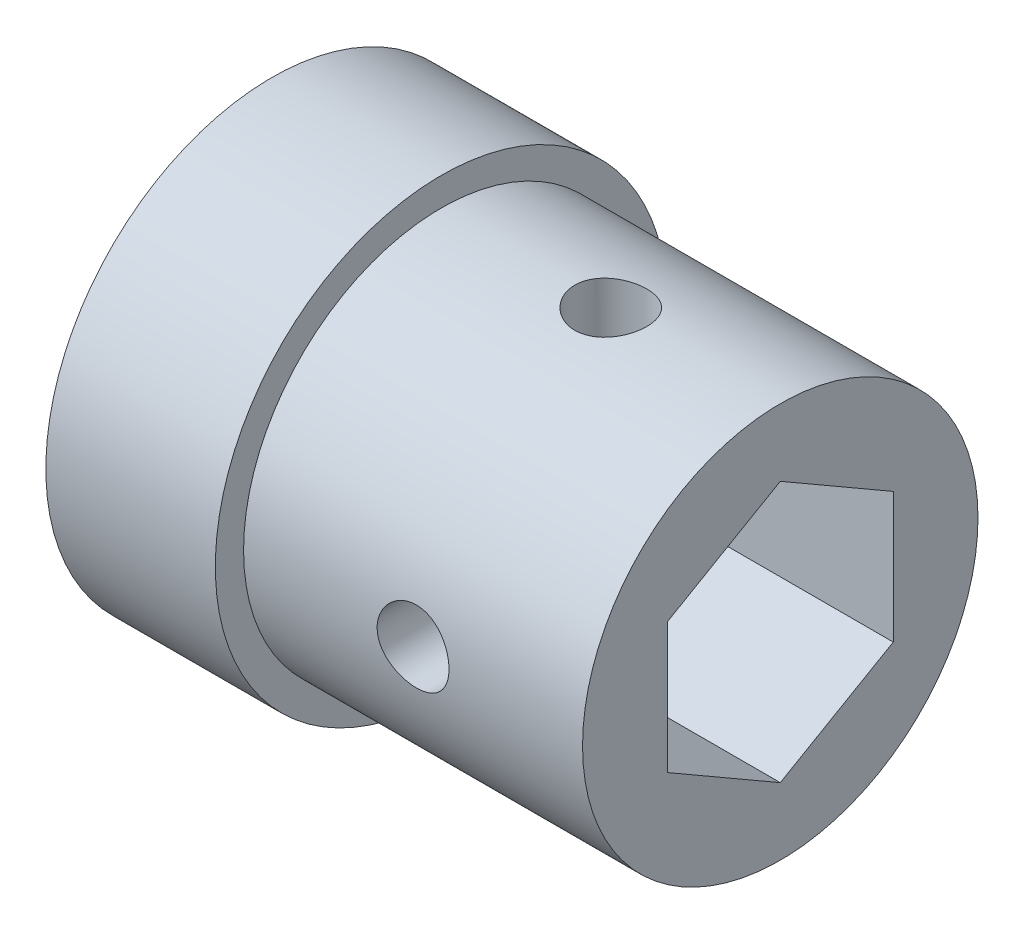
ISO-10303-21;
HEADER;
FILE_DESCRIPTION(('STEP AP214'),'2;1');
FILE_NAME('part.step','',(''),(''),'','','');
FILE_SCHEMA(('AUTOMOTIVE_DESIGN { 1 0 10303 214 1 1 1 1 }'));
ENDSEC;
DATA;
#1=APPLICATION_CONTEXT('core data for automotive mechanical design processes');
#2=APPLICATION_PROTOCOL_DEFINITION('international standard','automotive_design',2000,#1);
#3=PRODUCT_CONTEXT('',#1,'mechanical');
#4=PRODUCT('Part','Part','',(#3));
#5=PRODUCT_RELATED_PRODUCT_CATEGORY('part','',(#4));
#6=PRODUCT_DEFINITION_FORMATION('','',#4);
#7=PRODUCT_DEFINITION_CONTEXT('part definition',#1,'design');
#8=PRODUCT_DEFINITION('design','',#6,#7);
#9=PRODUCT_DEFINITION_SHAPE('','',#8);
#10=(LENGTH_UNIT() NAMED_UNIT(*) SI_UNIT(.MILLI.,.METRE.));
#11=(NAMED_UNIT(*) PLANE_ANGLE_UNIT() SI_UNIT($,.RADIAN.));
#12=(NAMED_UNIT(*) SI_UNIT($,.STERADIAN.) SOLID_ANGLE_UNIT());
#13=UNCERTAINTY_MEASURE_WITH_UNIT(LENGTH_MEASURE(1.E-05),#10,'distance_accuracy_value','');
#14=(GEOMETRIC_REPRESENTATION_CONTEXT(3) GLOBAL_UNCERTAINTY_ASSIGNED_CONTEXT((#13)) GLOBAL_UNIT_ASSIGNED_CONTEXT((#10,
#11,#12)) REPRESENTATION_CONTEXT('',''));
#15=CARTESIAN_POINT('',(0.,0.,0.));
#16=DIRECTION('',(0.,0.,1.));
#17=DIRECTION('',(1.,0.,0.));
#18=AXIS2_PLACEMENT_3D('',#15,#16,#17);
#19=CARTESIAN_POINT('',(19.05,0.,0.));
#20=DIRECTION('',(-1.,0.,0.));
#21=DIRECTION('',(0.,0.,1.));
#22=AXIS2_PLACEMENT_3D('',#19,#20,#21);
#23=CYLINDRICAL_SURFACE('',#22,11.1125);
#24=CARTESIAN_POINT('',(9.525,-10.927492107524,2.0193));
#25=CARTESIAN_POINT('',(9.63741571464594,-10.9274942479276,2.01929562453885));
#26=CARTESIAN_POINT('',(9.74988895347536,-10.9292456360929,2.00988078533845));
#27=CARTESIAN_POINT('',(9.97166849585116,-10.9360539135093,1.97249295178773));
#28=CARTESIAN_POINT('',(10.0809719589563,-10.9411136772958,1.94450381854633));
#29=CARTESIAN_POINT('',(10.2931707110257,-10.9539471550487,1.87085149450903));
#30=CARTESIAN_POINT('',(10.3960716941318,-10.9617184156445,1.82520427675663));
#31=CARTESIAN_POINT('',(10.59274701736,-10.9790963604896,1.71757315958674));
#32=CARTESIAN_POINT('',(10.6865221591054,-10.9887028833074,1.65559069685082));
#33=CARTESIAN_POINT('',(10.8633888268278,-11.0087944486512,1.51627569063185));
#34=CARTESIAN_POINT('',(10.9463581223899,-11.019287641196,1.4387891227856));
#35=CARTESIAN_POINT('',(11.0981938893631,-11.0398981279112,1.27099836132325));
#36=CARTESIAN_POINT('',(11.1670594616296,-11.0500153980822,1.18069335112305));
#37=CARTESIAN_POINT('',(11.289198615438,-11.0688211166408,0.989029326377053));
#38=CARTESIAN_POINT('',(11.3423573703822,-11.0774988485063,0.887595996407324));
#39=CARTESIAN_POINT('',(11.4308346213955,-11.0923566686645,0.677054556519217));
#40=CARTESIAN_POINT('',(11.4661544950637,-11.0985369498142,0.56794703997778));
#41=CARTESIAN_POINT('',(11.5175745746844,-11.1076459610505,0.346420024790664));
#42=CARTESIAN_POINT('',(11.5338806551012,-11.110609496146,0.234049767725365));
#43=CARTESIAN_POINT('',(11.5474513792986,-11.1130709598927,0.00813195897455713));
#44=CARTESIAN_POINT('',(11.5447175500613,-11.1125691664598,-0.105415497571425));
#45=CARTESIAN_POINT('',(11.5204447192093,-11.1081838124318,-0.329053873830443));
#46=CARTESIAN_POINT('',(11.4991273591352,-11.1043401114311,-0.439169743846034));
#47=CARTESIAN_POINT('',(11.4386426875808,-11.0937474408346,-0.654235041199763));
#48=CARTESIAN_POINT('',(11.3994747552592,-11.0869983701906,-0.759184288702558));
#49=CARTESIAN_POINT('',(11.3041869778782,-11.0712862914129,-0.961584802489706));
#50=CARTESIAN_POINT('',(11.2479777465881,-11.0623116559089,-1.05899304733415));
#51=CARTESIAN_POINT('',(11.1202686942995,-11.0431422975406,-1.24307787208303));
#52=CARTESIAN_POINT('',(11.0487674095024,-11.0329474579162,-1.32975342336873));
#53=CARTESIAN_POINT('',(10.8912802078699,-11.0122948730975,-1.49122465076577));
#54=CARTESIAN_POINT('',(10.805100430502,-11.0018354563335,-1.56583115827339));
#55=CARTESIAN_POINT('',(10.6213504792848,-10.9819734487472,-1.69955871636239));
#56=CARTESIAN_POINT('',(10.5237801581794,-10.9725708715907,-1.75867956671442));
#57=CARTESIAN_POINT('',(10.3197770942709,-10.9558851315019,-1.85980663148123));
#58=CARTESIAN_POINT('',(10.2133311201778,-10.9486052082511,-1.90178672365387));
#59=CARTESIAN_POINT('',(9.99473527527748,-10.9370396952462,-1.96721472173091));
#60=CARTESIAN_POINT('',(9.88258600992818,-10.9327537883581,-1.99066459043909));
#61=CARTESIAN_POINT('',(9.65746907358411,-10.9277239374021,-2.01809314349657));
#62=CARTESIAN_POINT('',(9.54453551057253,-10.9269306704052,-2.0223429923972));
#63=CARTESIAN_POINT('',(9.31957202028619,-10.9288441062186,-2.01197652271465));
#64=CARTESIAN_POINT('',(9.20754205142112,-10.9315506470053,-1.99736107750051));
#65=CARTESIAN_POINT('',(8.98844860194976,-10.9401129033596,-1.94991123522278));
#66=CARTESIAN_POINT('',(8.88135355603003,-10.9459442436527,-1.91721779502104));
#67=CARTESIAN_POINT('',(8.67416163256536,-10.9600782137802,-1.83468906800136));
#68=CARTESIAN_POINT('',(8.57406524385002,-10.9683810160241,-1.78485258524338));
#69=CARTESIAN_POINT('',(8.38251385532281,-10.9866353756862,-1.66882376958166));
#70=CARTESIAN_POINT('',(8.2911646952992,-10.9966038850072,-1.60245942302953));
#71=CARTESIAN_POINT('',(8.12080120780177,-11.0170182372045,-1.45549186237946));
#72=CARTESIAN_POINT('',(8.04178792013381,-11.0274641202234,-1.3748874491881));
#73=CARTESIAN_POINT('',(7.89733263273793,-11.0478140175228,-1.20051950020806));
#74=CARTESIAN_POINT('',(7.83207256466717,-11.0577096291294,-1.10660410944518));
#75=CARTESIAN_POINT('',(7.71825739784822,-11.075704599498,-0.908985032432479));
#76=CARTESIAN_POINT('',(7.66970168403101,-11.0838040243932,-0.805281706762241));
#77=CARTESIAN_POINT('',(7.59094902275308,-11.0972577887192,-0.591544064173564));
#78=CARTESIAN_POINT('',(7.56066104551837,-11.1026257181412,-0.481544180312206));
#79=CARTESIAN_POINT('',(7.5190122980801,-11.1100694988016,-0.257912513500643));
#80=CARTESIAN_POINT('',(7.50764966259566,-11.112145674474,-0.144281089600119));
#81=CARTESIAN_POINT('',(7.50423583864441,-11.1127661069681,0.0816401616549935));
#82=CARTESIAN_POINT('',(7.51190929546275,-11.1113607245087,0.193925783381406));
#83=CARTESIAN_POINT('',(7.54574892919576,-11.1052800632339,0.415579843228983));
#84=CARTESIAN_POINT('',(7.57191495150475,-11.1006048117561,0.524948305730901));
#85=CARTESIAN_POINT('',(7.64188384596283,-11.0885090659221,0.73752954311374));
#86=CARTESIAN_POINT('',(7.68565909734586,-11.0810928723142,0.840751669016099));
#87=CARTESIAN_POINT('',(7.78957155119753,-11.0643199926892,1.03842741882154));
#88=CARTESIAN_POINT('',(7.84970975962844,-11.0549631873756,1.13288050314227));
#89=CARTESIAN_POINT('',(7.98559710205793,-11.0351836324856,1.31171358455936));
#90=CARTESIAN_POINT('',(8.06154598219593,-11.0247482003332,1.39594041805536));
#91=CARTESIAN_POINT('',(8.22648269966318,-11.0040697572806,1.55054976487549));
#92=CARTESIAN_POINT('',(8.31547359340748,-10.9938267921219,1.62092902391868));
#93=CARTESIAN_POINT('',(8.50488272304162,-10.9745970364442,1.74641117202071));
#94=CARTESIAN_POINT('',(8.60539269861746,-10.9656218132998,1.80137740189507));
#95=CARTESIAN_POINT('',(8.81434838253022,-10.9500821249078,1.89355776058532));
#96=CARTESIAN_POINT('',(8.92278635681862,-10.9435153467981,1.93078893093947));
#97=CARTESIAN_POINT('',(9.11381278006685,-10.9349307314955,1.97872433354282));
#98=CARTESIAN_POINT('',(9.19527109710065,-10.9321575027132,1.9939146213903));
#99=CARTESIAN_POINT('',(9.35947590020537,-10.9284374249278,2.01420394264211));
#100=CARTESIAN_POINT('',(9.44222235484516,-10.9274905314315,2.01930322188381));
#101=CARTESIAN_POINT('',(9.525,-10.927492107524,2.0193));
#102=B_SPLINE_CURVE_WITH_KNOTS('',3,(#24,#25,#26,#27,#28,#29,#30,#31,#32,#33,#34,#35,#36,#37,
#38,#39,#40,#41,#42,#43,#44,#45,#46,#47,#48,#49,#50,#51,#52,#53,#54,#55,#56,#57,#58,#59,#60,#61,
#62,#63,#64,#65,#66,#67,#68,#69,#70,#71,#72,#73,#74,#75,#76,#77,#78,#79,#80,#81,#82,#83,#84,#85,
#86,#87,#88,#89,#90,#91,#92,#93,#94,#95,#96,#97,#98,#99,#100,#101),.UNSPECIFIED.,.T.,.F.,(4,2,2,
2,2,2,2,2,2,2,2,2,2,2,2,2,2,2,2,2,2,2,2,2,2,2,2,2,2,2,2,2,2,2,2,2,2,2,4),(0.,0.336944284715667,
0.674181718631307,1.01111480700285,1.34801827205879,1.68845160009202,2.02890662477942,
2.37179227332157,2.71465143863423,3.05376272614546,3.39284681757617,3.72794122016864,
4.06304727820357,4.39994239548042,4.73686977575418,5.07865184813357,5.42043833953273,
5.7627437812304,6.10501295954924,6.44243279615995,6.77983701247498,7.11464679485891,
7.44947993912018,7.78795522085332,8.12645901769887,8.46919290860149,8.8119141783898,
9.15291321558959,9.49387864194938,9.82994088270168,10.1660003138645,10.5015346653234,
10.8370896494341,11.177173638234,11.5173374540404,11.8604282704729,12.2031887441318,
12.4513047129901,12.6994146371674),.UNSPECIFIED.);
#103=CARTESIAN_POINT('',(9.525,-10.927492107524,2.0193));
#104=VERTEX_POINT('',#103);
#105=EDGE_CURVE('E142',#104,#104,#102,.T.);
#106=ORIENTED_EDGE('',*,*,#105,.T.);
#107=EDGE_LOOP('',(#106));
#108=FACE_BOUND('',#107,.T.);
#109=CARTESIAN_POINT('',(9.525,10.927492107524,2.0193));
#110=CARTESIAN_POINT('',(9.41258428535406,10.9274942479276,2.01929562453885));
#111=CARTESIAN_POINT('',(9.30011104652464,10.9292456360929,2.00988078533845));
#112=CARTESIAN_POINT('',(9.07833150414884,10.9360539135093,1.97249295178773));
#113=CARTESIAN_POINT('',(8.96902804104372,10.9411136772958,1.94450381854633));
#114=CARTESIAN_POINT('',(8.75682928897428,10.9539471550487,1.87085149450903));
#115=CARTESIAN_POINT('',(8.65392830586816,10.9617184156445,1.82520427675663));
#116=CARTESIAN_POINT('',(8.45725298263997,10.9790963604896,1.71757315958673));
#117=CARTESIAN_POINT('',(8.36347784089459,10.9887028833074,1.65559069685082));
#118=CARTESIAN_POINT('',(8.18661117317217,11.0087944486512,1.51627569063185));
#119=CARTESIAN_POINT('',(8.10364187761014,11.019287641196,1.4387891227856));
#120=CARTESIAN_POINT('',(7.95180611063692,11.0398981279112,1.27099836132325));
#121=CARTESIAN_POINT('',(7.88294053837044,11.0500153980822,1.18069335112305));
#122=CARTESIAN_POINT('',(7.76080138456204,11.0688211166408,0.989029326377052));
#123=CARTESIAN_POINT('',(7.70764262961784,11.0774988485063,0.887595996407323));
#124=CARTESIAN_POINT('',(7.61916537860448,11.0923566686645,0.677054556519216));
#125=CARTESIAN_POINT('',(7.58384550493628,11.0985369498142,0.567947039977779));
#126=CARTESIAN_POINT('',(7.53242542531562,11.1076459610505,0.346420024790664));
#127=CARTESIAN_POINT('',(7.51611934489877,11.110609496146,0.234049767725365));
#128=CARTESIAN_POINT('',(7.50254862070139,11.1130709598927,0.00813195897455697));
#129=CARTESIAN_POINT('',(7.50528244993872,11.1125691664598,-0.105415497571425));
#130=CARTESIAN_POINT('',(7.52955528079073,11.1081838124318,-0.329053873830443));
#131=CARTESIAN_POINT('',(7.55087264086479,11.1043401114311,-0.439169743846034));
#132=CARTESIAN_POINT('',(7.61135731241921,11.0937474408346,-0.654235041199763));
#133=CARTESIAN_POINT('',(7.65052524474085,11.0869983701906,-0.759184288702558));
#134=CARTESIAN_POINT('',(7.74581302212179,11.0712862914129,-0.961584802489705));
#135=CARTESIAN_POINT('',(7.8020222534119,11.0623116559089,-1.05899304733414));
#136=CARTESIAN_POINT('',(7.92973130570053,11.0431422975406,-1.24307787208303));
#137=CARTESIAN_POINT('',(8.00123259049759,11.0329474579162,-1.32975342336873));
#138=CARTESIAN_POINT('',(8.15871979213011,11.0122948730975,-1.49122465076577));
#139=CARTESIAN_POINT('',(8.24489956949799,11.0018354563335,-1.56583115827339));
#140=CARTESIAN_POINT('',(8.42864952071524,10.9819734487472,-1.69955871636239));
#141=CARTESIAN_POINT('',(8.52621984182062,10.9725708715907,-1.75867956671442));
#142=CARTESIAN_POINT('',(8.73022290572909,10.9558851315019,-1.85980663148123));
#143=CARTESIAN_POINT('',(8.83666887982225,10.9486052082511,-1.90178672365387));
#144=CARTESIAN_POINT('',(9.05526472472252,10.9370396952462,-1.96721472173091));
#145=CARTESIAN_POINT('',(9.16741399007183,10.9327537883581,-1.99066459043909));
#146=CARTESIAN_POINT('',(9.39253092641589,10.9277239374021,-2.01809314349657));
#147=CARTESIAN_POINT('',(9.50546448942747,10.9269306704052,-2.0223429923972));
#148=CARTESIAN_POINT('',(9.73042797971381,10.9288441062186,-2.01197652271465));
#149=CARTESIAN_POINT('',(9.84245794857888,10.9315506470053,-1.99736107750051));
#150=CARTESIAN_POINT('',(10.0615513980502,10.9401129033596,-1.94991123522278));
#151=CARTESIAN_POINT('',(10.16864644397,10.9459442436527,-1.91721779502104));
#152=CARTESIAN_POINT('',(10.3758383674346,10.9600782137802,-1.83468906800136));
#153=CARTESIAN_POINT('',(10.47593475615,10.9683810160241,-1.78485258524338));
#154=CARTESIAN_POINT('',(10.6674861446772,10.9866353756862,-1.66882376958166));
#155=CARTESIAN_POINT('',(10.7588353047008,10.9966038850072,-1.60245942302953));
#156=CARTESIAN_POINT('',(10.9291987921982,11.0170182372045,-1.45549186237946));
#157=CARTESIAN_POINT('',(11.0082120798662,11.0274641202234,-1.3748874491881));
#158=CARTESIAN_POINT('',(11.1526673672621,11.0478140175228,-1.20051950020806));
#159=CARTESIAN_POINT('',(11.2179274353328,11.0577096291294,-1.10660410944518));
#160=CARTESIAN_POINT('',(11.3317426021518,11.075704599498,-0.908985032432479));
#161=CARTESIAN_POINT('',(11.380298315969,11.0838040243932,-0.805281706762241));
#162=CARTESIAN_POINT('',(11.4590509772469,11.0972577887192,-0.591544064173565));
#163=CARTESIAN_POINT('',(11.4893389544816,11.1026257181412,-0.481544180312207));
#164=CARTESIAN_POINT('',(11.5309877019199,11.1100694988016,-0.257912513500643));
#165=CARTESIAN_POINT('',(11.5423503374043,11.112145674474,-0.144281089600119));
#166=CARTESIAN_POINT('',(11.5457641613556,11.1127661069681,0.0816401616549944));
#167=CARTESIAN_POINT('',(11.5380907045373,11.1113607245087,0.193925783381407));
#168=CARTESIAN_POINT('',(11.5042510708042,11.1052800632339,0.415579843228984));
#169=CARTESIAN_POINT('',(11.4780850484953,11.1006048117561,0.524948305730902));
#170=CARTESIAN_POINT('',(11.4081161540372,11.0885090659221,0.737529543113741));
#171=CARTESIAN_POINT('',(11.3643409026541,11.0810928723142,0.8407516690161));
#172=CARTESIAN_POINT('',(11.2604284488025,11.0643199926892,1.03842741882154));
#173=CARTESIAN_POINT('',(11.2002902403716,11.0549631873756,1.13288050314227));
#174=CARTESIAN_POINT('',(11.0644028979421,11.0351836324856,1.31171358455936));
#175=CARTESIAN_POINT('',(10.9884540178041,11.0247482003332,1.39594041805536));
#176=CARTESIAN_POINT('',(10.8235173003368,11.0040697572806,1.55054976487549));
#177=CARTESIAN_POINT('',(10.7345264065925,10.9938267921219,1.62092902391868));
#178=CARTESIAN_POINT('',(10.5451172769584,10.9745970364442,1.74641117202071));
#179=CARTESIAN_POINT('',(10.4446073013825,10.9656218132998,1.80137740189507));
#180=CARTESIAN_POINT('',(10.2356516174698,10.9500821249078,1.89355776058532));
#181=CARTESIAN_POINT('',(10.1272136431814,10.9435153467981,1.93078893093947));
#182=CARTESIAN_POINT('',(9.93618721993314,10.9349307314955,1.97872433354282));
#183=CARTESIAN_POINT('',(9.85472890289935,10.9321575027132,1.9939146213903));
#184=CARTESIAN_POINT('',(9.69052409979463,10.9284374249278,2.01420394264211));
#185=CARTESIAN_POINT('',(9.60777764515484,10.9274905314315,2.01930322188381));
#186=CARTESIAN_POINT('',(9.525,10.927492107524,2.0193));
#187=B_SPLINE_CURVE_WITH_KNOTS('',3,(#109,#110,#111,#112,#113,#114,#115,#116,#117,#118,#119,
#120,#121,#122,#123,#124,#125,#126,#127,#128,#129,#130,#131,#132,#133,#134,#135,#136,#137,#138,
#139,#140,#141,#142,#143,#144,#145,#146,#147,#148,#149,#150,#151,#152,#153,#154,#155,#156,#157,
#158,#159,#160,#161,#162,#163,#164,#165,#166,#167,#168,#169,#170,#171,#172,#173,#174,#175,#176,
#177,#178,#179,#180,#181,#182,#183,#184,#185,#186),.UNSPECIFIED.,.T.,.F.,(4,2,2,2,2,2,2,2,2,2,2,
2,2,2,2,2,2,2,2,2,2,2,2,2,2,2,2,2,2,2,2,2,2,2,2,2,2,2,4),(0.,0.336944284715668,
0.674181718631307,1.01111480700286,1.34801827205879,1.68845160009202,2.02890662477942,
2.37179227332157,2.71465143863423,3.05376272614546,3.39284681757617,3.72794122016864,
4.06304727820357,4.39994239548042,4.73686977575418,5.07865184813357,5.42043833953273,
5.7627437812304,6.10501295954924,6.44243279615995,6.77983701247498,7.11464679485891,
7.44947993912018,7.78795522085332,8.12645901769887,8.46919290860149,8.8119141783898,
9.15291321558959,9.49387864194938,9.82994088270168,10.1660003138645,10.5015346653234,
10.8370896494341,11.177173638234,11.5173374540404,11.8604282704729,12.2031887441318,
12.4513047129901,12.6994146371674),.UNSPECIFIED.);
#188=CARTESIAN_POINT('',(9.525,10.927492107524,2.0193));
#189=VERTEX_POINT('',#188);
#190=EDGE_CURVE('E149',#189,#189,#187,.T.);
#191=ORIENTED_EDGE('',*,*,#190,.T.);
#192=EDGE_LOOP('',(#191));
#193=FACE_BOUND('',#192,.T.);
#194=CARTESIAN_POINT('',(11.5443,0.,11.1125));
#195=CARTESIAN_POINT('',(11.5442956384951,-0.112432989835849,11.1124979885135));
#196=CARTESIAN_POINT('',(11.5348780032896,-0.224923464028337,11.1107759910982));
#197=CARTESIAN_POINT('',(11.4974780572091,-0.446738800050734,11.1040725309227));
#198=CARTESIAN_POINT('',(11.4694796724019,-0.556060835375275,11.0990882460572));
#199=CARTESIAN_POINT('',(11.3958002975736,-0.768298906333766,11.0864182001841));
#200=CARTESIAN_POINT('',(11.3501348449057,-0.87122047881134,11.0787348134541));
#201=CARTESIAN_POINT('',(11.2424607523193,-1.06793046786883,11.061507249447));
#202=CARTESIAN_POINT('',(11.1804535918238,-1.16171971015113,11.0519632406332));
#203=CARTESIAN_POINT('',(11.0411133461193,-1.33857114932867,11.0319488145126));
#204=CARTESIAN_POINT('',(10.9636317776942,-1.42151542062314,11.0214700131922));
#205=CARTESIAN_POINT('',(10.795861612609,-1.57330269206052,11.0008298095361));
#206=CARTESIAN_POINT('',(10.7055721302352,-1.64214471617645,10.9906684292106));
#207=CARTESIAN_POINT('',(10.5139223971318,-1.76425868450197,10.9717321974533));
#208=CARTESIAN_POINT('',(10.4124851601251,-1.81741162866863,10.962968163853));
#209=CARTESIAN_POINT('',(10.2019352565923,-1.90587706819594,10.9479365709283));
#210=CARTESIAN_POINT('',(10.0928232108529,-1.94119100460102,10.9416688099622));
#211=CARTESIAN_POINT('',(9.87127950590243,-1.99259950030999,10.9324235642105));
#212=CARTESIAN_POINT('',(9.75889692737193,-2.0088991391369,10.9294109970154));
#213=CARTESIAN_POINT('',(9.53295478427207,-2.02245270732,10.9269113681271));
#214=CARTESIAN_POINT('',(9.41939531957635,-2.01970823980588,10.9274240096824));
#215=CARTESIAN_POINT('',(9.19580236235012,-1.9954180096159,10.9318849084541));
#216=CARTESIAN_POINT('',(9.08574265354718,-1.97410462359451,10.9357907011094));
#217=CARTESIAN_POINT('',(8.87078760283144,-1.91364715344983,10.9465311853228));
#218=CARTESIAN_POINT('',(8.76589246842238,-1.8745023535377,10.9533659944568));
#219=CARTESIAN_POINT('',(8.56355969157733,-1.77926358030448,10.9692392211542));
#220=CARTESIAN_POINT('',(8.46616757674721,-1.72307500922543,10.9782898818098));
#221=CARTESIAN_POINT('',(8.28210636542859,-1.59541065673933,10.9975668225337));
#222=CARTESIAN_POINT('',(8.19543829435322,-1.52393341523826,11.0077932148433));
#223=CARTESIAN_POINT('',(8.03394201163334,-1.36646399655508,11.0284548489435));
#224=CARTESIAN_POINT('',(7.95930775419245,-1.28027287810177,11.0388909434048));
#225=CARTESIAN_POINT('',(7.82552950912854,-1.09649010187879,11.0586569463704));
#226=CARTESIAN_POINT('',(7.76638565944228,-0.998898342601531,11.0679868450241));
#227=CARTESIAN_POINT('',(7.66524171243905,-0.794888014920553,11.0845063665263));
#228=CARTESIAN_POINT('',(7.62326090774465,-0.688459674225095,11.0916935783821));
#229=CARTESIAN_POINT('',(7.55782615139168,-0.469902366166561,11.1030991079195));
#230=CARTESIAN_POINT('',(7.5343703530185,-0.357773968215309,11.1073177215291));
#231=CARTESIAN_POINT('',(7.50691936078852,-0.132668989316133,11.1122703306445));
#232=CARTESIAN_POINT('',(7.5026582744227,-0.0197258459973352,11.1130519332993));
#233=CARTESIAN_POINT('',(7.51300569054752,0.205259445528221,11.1111736388897));
#234=CARTESIAN_POINT('',(7.52761332446546,0.317301634969173,11.1085139002385));
#235=CARTESIAN_POINT('',(7.57506242076804,0.536467555565955,11.1000813655338));
#236=CARTESIAN_POINT('',(7.60777017934728,0.643621188415337,11.0943314055113));
#237=CARTESIAN_POINT('',(7.69034700818962,0.850924000538071,11.0803604679232));
#238=CARTESIAN_POINT('',(7.74021718754982,0.951072726625849,11.0721393306656));
#239=CARTESIAN_POINT('',(7.85629762689304,1.14266349464334,11.0540192797018));
#240=CARTESIAN_POINT('',(7.92267140633355,1.23400487596753,11.044103907104));
#241=CARTESIAN_POINT('',(8.06965261880538,1.40434832122246,11.0237396081454));
#242=CARTESIAN_POINT('',(8.15026129479308,1.48334930648382,11.0132906352486));
#243=CARTESIAN_POINT('',(8.32462472676376,1.62777265645695,10.9928800057886));
#244=CARTESIAN_POINT('',(8.41853040672714,1.69301407103819,10.9829260191508));
#245=CARTESIAN_POINT('',(8.61612457090074,1.80679655254053,10.9647834424417));
#246=CARTESIAN_POINT('',(8.71981270552776,1.8553382159517,10.9565947893193));
#247=CARTESIAN_POINT('',(8.9335556422954,1.93408262192783,10.9429694676423));
#248=CARTESIAN_POINT('',(9.04357828366633,1.9643703559241,10.9375200649759));
#249=CARTESIAN_POINT('',(9.26725837938072,2.00601092575812,10.9299603000043));
#250=CARTESIAN_POINT('',(9.38091544998831,2.01736575391526,10.9278495863684));
#251=CARTESIAN_POINT('',(9.60682728210531,2.02075470197014,10.9272232398915));
#252=CARTESIAN_POINT('',(9.71907771747502,2.01307406030949,10.9286545311314));
#253=CARTESIAN_POINT('',(9.94065950262624,1.97923235108117,10.9348336294031));
#254=CARTESIAN_POINT('',(10.0499908673847,1.9530713783497,10.9395814194155));
#255=CARTESIAN_POINT('',(10.262489991321,1.8831288340048,10.951836829957));
#256=CARTESIAN_POINT('',(10.3656675974996,1.83937633042678,10.9593398959369));
#257=CARTESIAN_POINT('',(10.5632636492036,1.73552329480197,10.9762639864209));
#258=CARTESIAN_POINT('',(10.6576815277515,1.67542170554133,10.9856851349478));
#259=CARTESIAN_POINT('',(10.8365103853485,1.53957725442834,11.0055496471138));
#260=CARTESIAN_POINT('',(10.9207617957554,1.46362612960233,11.0160055330534));
#261=CARTESIAN_POINT('',(11.0754196878681,1.29867447421249,11.0366659687779));
#262=CARTESIAN_POINT('',(11.1458229824072,1.20967094782521,11.0468704602323));
#263=CARTESIAN_POINT('',(11.2713342018357,1.02024909492466,11.0659783406538));
#264=CARTESIAN_POINT('',(11.326309011493,0.919741365011608,11.0748701101347));
#265=CARTESIAN_POINT('',(11.4185060126663,0.710789816655411,11.09023745001));
#266=CARTESIAN_POINT('',(11.4557451720379,0.60235369843308,11.0967153284989));
#267=CARTESIAN_POINT('',(11.503700628807,0.411306544377564,11.1051772350311));
#268=CARTESIAN_POINT('',(11.5188998546612,0.329824305020889,11.1079080067159));
#269=CARTESIAN_POINT('',(11.539201030896,0.165571749881169,11.1115701093197));
#270=CARTESIAN_POINT('',(11.5443032120376,0.0828014635791193,11.1125014813626));
#271=CARTESIAN_POINT('',(11.5443,0.,11.1125));
#272=B_SPLINE_CURVE_WITH_KNOTS('',3,(#194,#195,#196,#197,#198,#199,#200,#201,#202,#203,#204,
#205,#206,#207,#208,#209,#210,#211,#212,#213,#214,#215,#216,#217,#218,#219,#220,#221,#222,#223,
#224,#225,#226,#227,#228,#229,#230,#231,#232,#233,#234,#235,#236,#237,#238,#239,#240,#241,#242,
#243,#244,#245,#246,#247,#248,#249,#250,#251,#252,#253,#254,#255,#256,#257,#258,#259,#260,#261,
#262,#263,#264,#265,#266,#267,#268,#269,#270,#271),.UNSPECIFIED.,.T.,.F.,(4,2,2,2,2,2,2,2,2,2,2,
2,2,2,2,2,2,2,2,2,2,2,2,2,2,2,2,2,2,2,2,2,2,2,2,2,2,2,4),(0.,0.336996202624953,
0.674284316380851,1.01127647297664,1.34823813197692,1.68860350423484,2.02899242547922,
2.37190046404071,2.7147807978792,3.05392775101649,3.39304615516621,3.72798072322003,
4.06292873740648,4.39977092309278,4.73664529215483,5.07849933289814,5.42035641763036,
5.7625967271932,6.10480291531111,6.44225385653525,6.77968926463195,7.11466471580608,
7.44966181836011,7.7881204916593,8.12660873296898,8.46930355200644,8.81198612922759,
9.15306057434718,9.49409912576212,9.83005834478048,10.1660158397568,10.5014204691529,
10.8368467926518,11.1769946871034,11.5172207757901,11.8602978766063,12.2030460898537,
12.451233179623,12.6994145971828),.UNSPECIFIED.);
#273=CARTESIAN_POINT('',(11.5443,0.,11.1125));
#274=VERTEX_POINT('',#273);
#275=EDGE_CURVE('E182',#274,#274,#272,.T.);
#276=ORIENTED_EDGE('',*,*,#275,.T.);
#277=EDGE_LOOP('',(#276));
#278=FACE_BOUND('',#277,.T.);
#279=CARTESIAN_POINT('',(11.5443,0.,-11.1125));
#280=CARTESIAN_POINT('',(11.5442956384951,0.112432989835849,-11.1124979885135));
#281=CARTESIAN_POINT('',(11.5348780032896,0.224923464028337,-11.1107759910982));
#282=CARTESIAN_POINT('',(11.4974780572091,0.446738800050734,-11.1040725309227));
#283=CARTESIAN_POINT('',(11.4694796724019,0.556060835375275,-11.0990882460572));
#284=CARTESIAN_POINT('',(11.3958002975736,0.768298906333766,-11.0864182001841));
#285=CARTESIAN_POINT('',(11.3501348449057,0.87122047881134,-11.0787348134541));
#286=CARTESIAN_POINT('',(11.2424607523193,1.06793046786883,-11.061507249447));
#287=CARTESIAN_POINT('',(11.1804535918238,1.16171971015113,-11.0519632406332));
#288=CARTESIAN_POINT('',(11.0411133461193,1.33857114932867,-11.0319488145126));
#289=CARTESIAN_POINT('',(10.9636317776942,1.42151542062314,-11.0214700131922));
#290=CARTESIAN_POINT('',(10.795861612609,1.57330269206052,-11.0008298095361));
#291=CARTESIAN_POINT('',(10.7055721302352,1.64214471617645,-10.9906684292106));
#292=CARTESIAN_POINT('',(10.5139223971318,1.76425868450197,-10.9717321974533));
#293=CARTESIAN_POINT('',(10.4124851601251,1.81741162866863,-10.962968163853));
#294=CARTESIAN_POINT('',(10.2019352565923,1.90587706819594,-10.9479365709283));
#295=CARTESIAN_POINT('',(10.0928232108529,1.94119100460102,-10.9416688099622));
#296=CARTESIAN_POINT('',(9.87127950590242,1.99259950030999,-10.9324235642105));
#297=CARTESIAN_POINT('',(9.75889692737193,2.0088991391369,-10.9294109970154));
#298=CARTESIAN_POINT('',(9.53295478427207,2.02245270732,-10.9269113681271));
#299=CARTESIAN_POINT('',(9.41939531957635,2.01970823980588,-10.9274240096824));
#300=CARTESIAN_POINT('',(9.19580236235012,1.9954180096159,-10.9318849084541));
#301=CARTESIAN_POINT('',(9.08574265354718,1.97410462359451,-10.9357907011094));
#302=CARTESIAN_POINT('',(8.87078760283144,1.91364715344983,-10.9465311853228));
#303=CARTESIAN_POINT('',(8.76589246842238,1.8745023535377,-10.9533659944568));
#304=CARTESIAN_POINT('',(8.56355969157733,1.77926358030448,-10.9692392211542));
#305=CARTESIAN_POINT('',(8.46616757674721,1.72307500922543,-10.9782898818098));
#306=CARTESIAN_POINT('',(8.28210636542859,1.59541065673933,-10.9975668225337));
#307=CARTESIAN_POINT('',(8.19543829435322,1.52393341523826,-11.0077932148433));
#308=CARTESIAN_POINT('',(8.03394201163334,1.36646399655508,-11.0284548489435));
#309=CARTESIAN_POINT('',(7.95930775419244,1.28027287810177,-11.0388909434048));
#310=CARTESIAN_POINT('',(7.82552950912854,1.09649010187879,-11.0586569463704));
#311=CARTESIAN_POINT('',(7.76638565944228,0.998898342601531,-11.0679868450241));
#312=CARTESIAN_POINT('',(7.66524171243905,0.794888014920553,-11.0845063665263));
#313=CARTESIAN_POINT('',(7.62326090774465,0.688459674225096,-11.0916935783821));
#314=CARTESIAN_POINT('',(7.55782615139168,0.469902366166561,-11.1030991079195));
#315=CARTESIAN_POINT('',(7.5343703530185,0.357773968215309,-11.1073177215291));
#316=CARTESIAN_POINT('',(7.50691936078852,0.132668989316133,-11.1122703306445));
#317=CARTESIAN_POINT('',(7.5026582744227,0.0197258459973346,-11.1130519332993));
#318=CARTESIAN_POINT('',(7.51300569054752,-0.205259445528222,-11.1111736388897));
#319=CARTESIAN_POINT('',(7.52761332446546,-0.317301634969174,-11.1085139002385));
#320=CARTESIAN_POINT('',(7.57506242076804,-0.536467555565956,-11.1000813655338));
#321=CARTESIAN_POINT('',(7.60777017934729,-0.643621188415338,-11.0943314055113));
#322=CARTESIAN_POINT('',(7.69034700818962,-0.850924000538071,-11.0803604679232));
#323=CARTESIAN_POINT('',(7.74021718754982,-0.951072726625849,-11.0721393306656));
#324=CARTESIAN_POINT('',(7.85629762689304,-1.14266349464334,-11.0540192797018));
#325=CARTESIAN_POINT('',(7.92267140633355,-1.23400487596753,-11.044103907104));
#326=CARTESIAN_POINT('',(8.06965261880538,-1.40434832122246,-11.0237396081454));
#327=CARTESIAN_POINT('',(8.15026129479309,-1.48334930648382,-11.0132906352486));
#328=CARTESIAN_POINT('',(8.32462472676376,-1.62777265645695,-10.9928800057886));
#329=CARTESIAN_POINT('',(8.41853040672714,-1.69301407103819,-10.9829260191508));
#330=CARTESIAN_POINT('',(8.61612457090075,-1.80679655254053,-10.9647834424417));
#331=CARTESIAN_POINT('',(8.71981270552776,-1.8553382159517,-10.9565947893193));
#332=CARTESIAN_POINT('',(8.9335556422954,-1.93408262192783,-10.9429694676423));
#333=CARTESIAN_POINT('',(9.04357828366633,-1.9643703559241,-10.9375200649759));
#334=CARTESIAN_POINT('',(9.26725837938072,-2.00601092575812,-10.9299603000043));
#335=CARTESIAN_POINT('',(9.38091544998831,-2.01736575391526,-10.9278495863684));
#336=CARTESIAN_POINT('',(9.60682728210531,-2.02075470197014,-10.9272232398915));
#337=CARTESIAN_POINT('',(9.71907771747502,-2.01307406030949,-10.9286545311314));
#338=CARTESIAN_POINT('',(9.94065950262624,-1.97923235108117,-10.9348336294031));
#339=CARTESIAN_POINT('',(10.0499908673847,-1.9530713783497,-10.9395814194155));
#340=CARTESIAN_POINT('',(10.262489991321,-1.8831288340048,-10.951836829957));
#341=CARTESIAN_POINT('',(10.3656675974996,-1.83937633042678,-10.9593398959369));
#342=CARTESIAN_POINT('',(10.5632636492036,-1.73552329480197,-10.9762639864209));
#343=CARTESIAN_POINT('',(10.6576815277515,-1.67542170554133,-10.9856851349478));
#344=CARTESIAN_POINT('',(10.8365103853485,-1.53957725442834,-11.0055496471138));
#345=CARTESIAN_POINT('',(10.9207617957554,-1.46362612960233,-11.0160055330534));
#346=CARTESIAN_POINT('',(11.0754196878681,-1.29867447421249,-11.0366659687779));
#347=CARTESIAN_POINT('',(11.1458229824072,-1.20967094782521,-11.0468704602323));
#348=CARTESIAN_POINT('',(11.2713342018357,-1.02024909492466,-11.0659783406538));
#349=CARTESIAN_POINT('',(11.326309011493,-0.919741365011607,-11.0748701101347));
#350=CARTESIAN_POINT('',(11.4185060126663,-0.710789816655411,-11.09023745001));
#351=CARTESIAN_POINT('',(11.4557451720379,-0.602353698433079,-11.0967153284989));
#352=CARTESIAN_POINT('',(11.503700628807,-0.411306544377564,-11.1051772350311));
#353=CARTESIAN_POINT('',(11.5188998546612,-0.329824305020889,-11.1079080067159));
#354=CARTESIAN_POINT('',(11.539201030896,-0.165571749881169,-11.1115701093197));
#355=CARTESIAN_POINT('',(11.5443032120376,-0.0828014635791195,-11.1125014813626));
#356=CARTESIAN_POINT('',(11.5443,0.,-11.1125));
#357=B_SPLINE_CURVE_WITH_KNOTS('',3,(#279,#280,#281,#282,#283,#284,#285,#286,#287,#288,#289,
#290,#291,#292,#293,#294,#295,#296,#297,#298,#299,#300,#301,#302,#303,#304,#305,#306,#307,#308,
#309,#310,#311,#312,#313,#314,#315,#316,#317,#318,#319,#320,#321,#322,#323,#324,#325,#326,#327,
#328,#329,#330,#331,#332,#333,#334,#335,#336,#337,#338,#339,#340,#341,#342,#343,#344,#345,#346,
#347,#348,#349,#350,#351,#352,#353,#354,#355,#356),.UNSPECIFIED.,.T.,.F.,(4,2,2,2,2,2,2,2,2,2,2,
2,2,2,2,2,2,2,2,2,2,2,2,2,2,2,2,2,2,2,2,2,2,2,2,2,2,2,4),(0.,0.336996202624953,
0.674284316380851,1.01127647297664,1.34823813197692,1.68860350423485,2.02899242547923,
2.37190046404071,2.7147807978792,3.05392775101649,3.39304615516621,3.72798072322003,
4.06292873740648,4.39977092309278,4.73664529215484,5.07849933289814,5.42035641763036,
5.7625967271932,6.10480291531111,6.44225385653525,6.77968926463195,7.11466471580608,
7.44966181836011,7.7881204916593,8.12660873296898,8.46930355200644,8.8119861292276,
9.15306057434718,9.49409912576212,9.83005834478048,10.1660158397568,10.5014204691529,
10.8368467926518,11.1769946871034,11.5172207757902,11.8602978766063,12.2030460898538,
12.451233179623,12.6994145971828),.UNSPECIFIED.);
#358=CARTESIAN_POINT('',(11.5443,0.,-11.1125));
#359=VERTEX_POINT('',#358);
#360=EDGE_CURVE('E146',#359,#359,#357,.T.);
#361=ORIENTED_EDGE('',*,*,#360,.T.);
#362=EDGE_LOOP('',(#361));
#363=FACE_BOUND('',#362,.T.);
#364=CARTESIAN_POINT('',(19.05,0.,0.));
#365=DIRECTION('',(1.,0.,0.));
#366=DIRECTION('',(0.,0.,-1.));
#367=AXIS2_PLACEMENT_3D('',#364,#365,#366);
#368=CIRCLE('',#367,11.1125);
#369=CARTESIAN_POINT('',(19.05,0.,-11.1125));
#370=VERTEX_POINT('',#369);
#371=EDGE_CURVE('E49',#370,#370,#368,.T.);
#372=ORIENTED_EDGE('',*,*,#371,.F.);
#373=EDGE_LOOP('',(#372));
#374=FACE_BOUND('',#373,.T.);
#375=CARTESIAN_POINT('',(0.,0.,0.));
#376=DIRECTION('',(1.,0.,0.));
#377=DIRECTION('',(0.,0.,-1.));
#378=AXIS2_PLACEMENT_3D('',#375,#376,#377);
#379=CIRCLE('',#378,11.1125);
#380=CARTESIAN_POINT('',(0.,0.,-11.1125));
#381=VERTEX_POINT('',#380);
#382=EDGE_CURVE('E131',#381,#381,#379,.T.);
#383=ORIENTED_EDGE('',*,*,#382,.T.);
#384=EDGE_LOOP('',(#383));
#385=FACE_BOUND('',#384,.T.);
#386=ADVANCED_FACE('F41',(#108,#193,#278,#363,#374,#385),#23,.T.);
#387=CARTESIAN_POINT('',(19.05,0.,0.));
#388=DIRECTION('',(1.,0.,0.));
#389=DIRECTION('',(0.,0.,-1.));
#390=AXIS2_PLACEMENT_3D('',#387,#388,#389);
#391=PLANE('',#390);
#392=DIRECTION('',(0.,0.5,-0.866025403784439));
#393=VECTOR('',#392,1.);
#394=CARTESIAN_POINT('',(19.05,3.66617420935413,6.34999999999999));
#395=LINE('',#394,#393);
#396=CARTESIAN_POINT('',(19.05,3.66617420935413,6.34999999999999));
#397=VERTEX_POINT('',#396);
#398=CARTESIAN_POINT('',(19.05,7.33234841870825,0.));
#399=VERTEX_POINT('',#398);
#400=EDGE_CURVE('E189',#397,#399,#395,.T.);
#401=ORIENTED_EDGE('',*,*,#400,.T.);
#402=DIRECTION('',(0.,-0.5,-0.866025403784438));
#403=VECTOR('',#402,1.);
#404=CARTESIAN_POINT('',(19.05,7.33234841870825,0.));
#405=LINE('',#404,#403);
#406=CARTESIAN_POINT('',(19.05,3.66617420935412,-6.35));
#407=VERTEX_POINT('',#406);
#408=EDGE_CURVE('E119',#399,#407,#405,.T.);
#409=ORIENTED_EDGE('',*,*,#408,.T.);
#410=DIRECTION('',(0.,-1.,0.));
#411=VECTOR('',#410,1.);
#412=CARTESIAN_POINT('',(19.05,3.66617420935412,-6.35));
#413=LINE('',#412,#411);
#414=CARTESIAN_POINT('',(19.05,-3.66617420935412,-6.35));
#415=VERTEX_POINT('',#414);
#416=EDGE_CURVE('E193',#407,#415,#413,.T.);
#417=ORIENTED_EDGE('',*,*,#416,.T.);
#418=DIRECTION('',(0.,-0.5,0.866025403784439));
#419=VECTOR('',#418,1.);
#420=CARTESIAN_POINT('',(19.05,-3.66617420935412,-6.35));
#421=LINE('',#420,#419);
#422=CARTESIAN_POINT('',(19.05,-7.33234841870824,0.));
#423=VERTEX_POINT('',#422);
#424=EDGE_CURVE('E196',#415,#423,#421,.T.);
#425=ORIENTED_EDGE('',*,*,#424,.T.);
#426=DIRECTION('',(0.,0.5,0.866025403784439));
#427=VECTOR('',#426,1.);
#428=CARTESIAN_POINT('',(19.05,-7.33234841870824,0.));
#429=LINE('',#428,#427);
#430=CARTESIAN_POINT('',(19.05,-3.66617420935412,6.35));
#431=VERTEX_POINT('',#430);
#432=EDGE_CURVE('E199',#423,#431,#429,.T.);
#433=ORIENTED_EDGE('',*,*,#432,.T.);
#434=DIRECTION('',(0.,1.,0.));
#435=VECTOR('',#434,1.);
#436=CARTESIAN_POINT('',(19.05,-3.66617420935412,6.35));
#437=LINE('',#436,#435);
#438=EDGE_CURVE('E125',#431,#397,#437,.T.);
#439=ORIENTED_EDGE('',*,*,#438,.T.);
#440=EDGE_LOOP('',(#401,#409,#417,#425,#433,#439));
#441=FACE_BOUND('',#440,.T.);
#442=ORIENTED_EDGE('',*,*,#371,.T.);
#443=EDGE_LOOP('',(#442));
#444=FACE_BOUND('',#443,.T.);
#445=ADVANCED_FACE('F244',(#441,#444),#391,.T.);
#446=CARTESIAN_POINT('',(-9.525,0.,0.));
#447=DIRECTION('',(1.,0.,0.));
#448=DIRECTION('',(0.,0.,-1.));
#449=AXIS2_PLACEMENT_3D('',#446,#447,#448);
#450=CYLINDRICAL_SURFACE('',#449,12.7);
#451=CARTESIAN_POINT('',(-9.525,0.,0.));
#452=DIRECTION('',(-1.,0.,0.));
#453=DIRECTION('',(0.,0.,1.));
#454=AXIS2_PLACEMENT_3D('',#451,#452,#453);
#455=CIRCLE('',#454,12.7);
#456=CARTESIAN_POINT('',(-9.525,0.,-12.7));
#457=VERTEX_POINT('',#456);
#458=EDGE_CURVE('E128',#457,#457,#455,.T.);
#459=CARTESIAN_POINT('',(0.,0.,0.));
#460=DIRECTION('',(-1.,0.,0.));
#461=DIRECTION('',(0.,0.,1.));
#462=AXIS2_PLACEMENT_3D('',#459,#460,#461);
#463=CIRCLE('',#462,12.7);
#464=CARTESIAN_POINT('',(0.,0.,-12.7));
#465=VERTEX_POINT('',#464);
#466=EDGE_CURVE('E132',#465,#465,#463,.T.);
#467=CARTESIAN_POINT('',(-9.525,0.,-12.7));
#468=CARTESIAN_POINT('',(-9.42578125,0.,-12.7));
#469=CARTESIAN_POINT('',(-9.3265625,0.,-12.7));
#470=CARTESIAN_POINT('',(-9.128125,0.,-12.7));
#471=CARTESIAN_POINT('',(-9.02890625,0.,-12.7));
#472=CARTESIAN_POINT('',(-8.83046875,0.,-12.7));
#473=CARTESIAN_POINT('',(-8.73125,0.,-12.7));
#474=CARTESIAN_POINT('',(-8.5328125,0.,-12.7));
#475=CARTESIAN_POINT('',(-8.43359375,0.,-12.7));
#476=CARTESIAN_POINT('',(-8.23515625,0.,-12.7));
#477=CARTESIAN_POINT('',(-8.1359375,0.,-12.7));
#478=CARTESIAN_POINT('',(-7.9375,0.,-12.7));
#479=CARTESIAN_POINT('',(-7.83828125,0.,-12.7));
#480=CARTESIAN_POINT('',(-7.63984375,0.,-12.7));
#481=CARTESIAN_POINT('',(-7.540625,0.,-12.7));
#482=CARTESIAN_POINT('',(-7.3421875,0.,-12.7));
#483=CARTESIAN_POINT('',(-7.24296875,0.,-12.7));
#484=CARTESIAN_POINT('',(-7.04453125,0.,-12.7));
#485=CARTESIAN_POINT('',(-6.9453125,0.,-12.7));
#486=CARTESIAN_POINT('',(-6.746875,0.,-12.7));
#487=CARTESIAN_POINT('',(-6.64765625,0.,-12.7));
#488=CARTESIAN_POINT('',(-6.44921875,0.,-12.7));
#489=CARTESIAN_POINT('',(-6.35,0.,-12.7));
#490=CARTESIAN_POINT('',(-6.1515625,0.,-12.7));
#491=CARTESIAN_POINT('',(-6.05234375,0.,-12.7));
#492=CARTESIAN_POINT('',(-5.85390625,0.,-12.7));
#493=CARTESIAN_POINT('',(-5.7546875,0.,-12.7));
#494=CARTESIAN_POINT('',(-5.55625,0.,-12.7));
#495=CARTESIAN_POINT('',(-5.45703125,0.,-12.7));
#496=CARTESIAN_POINT('',(-5.25859375,0.,-12.7));
#497=CARTESIAN_POINT('',(-5.159375,0.,-12.7));
#498=CARTESIAN_POINT('',(-4.9609375,0.,-12.7));
#499=CARTESIAN_POINT('',(-4.86171875,0.,-12.7));
#500=CARTESIAN_POINT('',(-4.66328125,0.,-12.7));
#501=CARTESIAN_POINT('',(-4.5640625,0.,-12.7));
#502=CARTESIAN_POINT('',(-4.365625,0.,-12.7));
#503=CARTESIAN_POINT('',(-4.26640625,0.,-12.7));
#504=CARTESIAN_POINT('',(-4.06796875,0.,-12.7));
#505=CARTESIAN_POINT('',(-3.96875,0.,-12.7));
#506=CARTESIAN_POINT('',(-3.7703125,0.,-12.7));
#507=CARTESIAN_POINT('',(-3.67109375,0.,-12.7));
#508=CARTESIAN_POINT('',(-3.47265625,0.,-12.7));
#509=CARTESIAN_POINT('',(-3.3734375,0.,-12.7));
#510=CARTESIAN_POINT('',(-3.175,0.,-12.7));
#511=CARTESIAN_POINT('',(-3.07578125,0.,-12.7));
#512=CARTESIAN_POINT('',(-2.87734375,0.,-12.7));
#513=CARTESIAN_POINT('',(-2.778125,0.,-12.7));
#514=CARTESIAN_POINT('',(-2.5796875,0.,-12.7));
#515=CARTESIAN_POINT('',(-2.48046875,0.,-12.7));
#516=CARTESIAN_POINT('',(-2.28203125,0.,-12.7));
#517=CARTESIAN_POINT('',(-2.1828125,0.,-12.7));
#518=CARTESIAN_POINT('',(-1.984375,0.,-12.7));
#519=CARTESIAN_POINT('',(-1.88515625,0.,-12.7));
#520=CARTESIAN_POINT('',(-1.68671875,0.,-12.7));
#521=CARTESIAN_POINT('',(-1.5875,0.,-12.7));
#522=CARTESIAN_POINT('',(-1.3890625,0.,-12.7));
#523=CARTESIAN_POINT('',(-1.28984375,0.,-12.7));
#524=CARTESIAN_POINT('',(-1.09140625,0.,-12.7));
#525=CARTESIAN_POINT('',(-0.992187500000001,0.,-12.7));
#526=CARTESIAN_POINT('',(-0.793750000000001,0.,-12.7));
#527=CARTESIAN_POINT('',(-0.69453125,0.,-12.7));
#528=CARTESIAN_POINT('',(-0.49609375,0.,-12.7));
#529=CARTESIAN_POINT('',(-0.396875,0.,-12.7));
#530=CARTESIAN_POINT('',(-0.1984375,0.,-12.7));
#531=CARTESIAN_POINT('',(-0.0992187500000001,0.,-12.7));
#532=CARTESIAN_POINT('',(0.,0.,-12.7));
#533=B_SPLINE_CURVE_WITH_KNOTS('',3,(#467,#468,#469,#470,#471,#472,#473,#474,#475,#476,#477,
#478,#479,#480,#481,#482,#483,#484,#485,#486,#487,#488,#489,#490,#491,#492,#493,#494,#495,#496,
#497,#498,#499,#500,#501,#502,#503,#504,#505,#506,#507,#508,#509,#510,#511,#512,#513,#514,#515,
#516,#517,#518,#519,#520,#521,#522,#523,#524,#525,#526,#527,#528,#529,#530,#531,#532),
.UNSPECIFIED.,.F.,.F.,(4,2,2,2,2,2,2,2,2,2,2,2,2,2,2,2,2,2,2,2,2,2,2,2,2,2,2,2,2,2,2,2,4),(0.,
0.29765625,0.5953125,0.892968750000001,1.190625,1.48828125,1.7859375,2.08359375,2.38125,
2.67890625,2.9765625,3.27421875,3.571875,3.86953125,4.1671875,4.46484375,4.7625,5.06015625,
5.3578125,5.65546875,5.953125,6.25078125,6.5484375,6.84609375,7.14375,7.44140625,7.7390625,
8.03671875,8.334375,8.63203125,8.9296875,9.22734375,9.525),.UNSPECIFIED.);
#534=EDGE_CURVE('BSEAM265',#457,#465,#533,.T.);
#535=ORIENTED_EDGE('',*,*,#458,.F.);
#536=ORIENTED_EDGE('',*,*,#466,.T.);
#537=ORIENTED_EDGE('',*,*,#534,.T.);
#538=ORIENTED_EDGE('',*,*,#534,.F.);
#539=EDGE_LOOP('',(#535,#537,#536,#538));
#540=FACE_BOUND('',#539,.T.);
#541=ADVANCED_FACE('F265',(#540),#450,.T.);
#542=CARTESIAN_POINT('',(-9.525,0.,0.));
#543=DIRECTION('',(-1.,0.,0.));
#544=DIRECTION('',(0.,0.,1.));
#545=AXIS2_PLACEMENT_3D('',#542,#543,#544);
#546=PLANE('',#545);
#547=DIRECTION('',(0.,0.5,-0.866025403784439));
#548=VECTOR('',#547,1.);
#549=CARTESIAN_POINT('',(-9.525,3.66617420935413,6.34999999999999));
#550=LINE('',#549,#548);
#551=CARTESIAN_POINT('',(-9.525,3.66617420935413,6.34999999999999));
#552=VERTEX_POINT('',#551);
#553=CARTESIAN_POINT('',(-9.525,7.33234841870825,0.));
#554=VERTEX_POINT('',#553);
#555=EDGE_CURVE('E188',#552,#554,#550,.T.);
#556=ORIENTED_EDGE('',*,*,#555,.F.);
#557=DIRECTION('',(0.,1.,0.));
#558=VECTOR('',#557,1.);
#559=CARTESIAN_POINT('',(-9.525,-3.66617420935412,6.35));
#560=LINE('',#559,#558);
#561=CARTESIAN_POINT('',(-9.525,-3.66617420935412,6.35));
#562=VERTEX_POINT('',#561);
#563=EDGE_CURVE('E191',#562,#552,#560,.T.);
#564=ORIENTED_EDGE('',*,*,#563,.F.);
#565=DIRECTION('',(0.,0.5,0.866025403784439));
#566=VECTOR('',#565,1.);
#567=CARTESIAN_POINT('',(-9.525,-7.33234841870824,0.));
#568=LINE('',#567,#566);
#569=CARTESIAN_POINT('',(-9.525,-7.33234841870824,0.));
#570=VERTEX_POINT('',#569);
#571=EDGE_CURVE('E214',#570,#562,#568,.T.);
#572=ORIENTED_EDGE('',*,*,#571,.F.);
#573=DIRECTION('',(0.,-0.5,0.866025403784439));
#574=VECTOR('',#573,1.);
#575=CARTESIAN_POINT('',(-9.525,-3.66617420935412,-6.35));
#576=LINE('',#575,#574);
#577=CARTESIAN_POINT('',(-9.525,-3.66617420935412,-6.35));
#578=VERTEX_POINT('',#577);
#579=EDGE_CURVE('E211',#578,#570,#576,.T.);
#580=ORIENTED_EDGE('',*,*,#579,.F.);
#581=DIRECTION('',(0.,-1.,0.));
#582=VECTOR('',#581,1.);
#583=CARTESIAN_POINT('',(-9.525,3.66617420935412,-6.35));
#584=LINE('',#583,#582);
#585=CARTESIAN_POINT('',(-9.525,3.66617420935412,-6.35));
#586=VERTEX_POINT('',#585);
#587=EDGE_CURVE('E208',#586,#578,#584,.T.);
#588=ORIENTED_EDGE('',*,*,#587,.F.);
#589=DIRECTION('',(0.,-0.5,-0.866025403784438));
#590=VECTOR('',#589,1.);
#591=CARTESIAN_POINT('',(-9.525,7.33234841870825,0.));
#592=LINE('',#591,#590);
#593=EDGE_CURVE('E205',#554,#586,#592,.T.);
#594=ORIENTED_EDGE('',*,*,#593,.F.);
#595=EDGE_LOOP('',(#556,#564,#572,#580,#588,#594));
#596=FACE_BOUND('',#595,.T.);
#597=ORIENTED_EDGE('',*,*,#458,.T.);
#598=EDGE_LOOP('',(#597));
#599=FACE_BOUND('',#598,.T.);
#600=ADVANCED_FACE('F237',(#596,#599),#546,.T.);
#601=CARTESIAN_POINT('',(0.,0.,0.));
#602=DIRECTION('',(-1.,0.,0.));
#603=DIRECTION('',(0.,0.,1.));
#604=AXIS2_PLACEMENT_3D('',#601,#602,#603);
#605=PLANE('',#604);
#606=ORIENTED_EDGE('',*,*,#382,.F.);
#607=EDGE_LOOP('',(#606));
#608=FACE_BOUND('',#607,.T.);
#609=ORIENTED_EDGE('',*,*,#466,.F.);
#610=EDGE_LOOP('',(#609));
#611=FACE_BOUND('',#610,.T.);
#612=ADVANCED_FACE('F278',(#608,#611),#605,.F.);
#613=CARTESIAN_POINT('',(19.05,3.66617420935413,6.34999999999999));
#614=DIRECTION('',(0.,0.866025403784439,0.5));
#615=DIRECTION('',(0.,-0.5,0.866025403784439));
#616=AXIS2_PLACEMENT_3D('',#613,#614,#615);
#617=PLANE('',#616);
#618=DIRECTION('',(-1.,0.,0.));
#619=VECTOR('',#618,1.);
#620=CARTESIAN_POINT('',(19.05,7.33234841870825,0.));
#621=LINE('',#620,#619);
#622=CARTESIAN_POINT('',(7.5057,7.33234841870825,0.));
#623=VERTEX_POINT('',#622);
#624=EDGE_CURVE('E113',#623,#554,#621,.T.);
#625=ORIENTED_EDGE('',*,*,#624,.F.);
#626=CARTESIAN_POINT('',(9.525,7.33234841870824,0.));
#627=DIRECTION('',(0.,0.866025403784439,0.5));
#628=DIRECTION('',(0.,0.5,-0.866025403784439));
#629=AXIS2_PLACEMENT_3D('',#626,#627,#628);
#630=ELLIPSE('',#629,2.33168679714922,2.0193);
#631=CARTESIAN_POINT('',(11.5443,7.33234841870825,0.));
#632=VERTEX_POINT('',#631);
#633=EDGE_CURVE('E62',#623,#632,#630,.T.);
#634=ORIENTED_EDGE('',*,*,#633,.T.);
#635=EDGE_CURVE('E110',#399,#632,#621,.T.);
#636=ORIENTED_EDGE('',*,*,#635,.F.);
#637=ORIENTED_EDGE('',*,*,#400,.F.);
#638=DIRECTION('',(-1.,0.,0.));
#639=VECTOR('',#638,1.);
#640=CARTESIAN_POINT('',(19.05,3.66617420935413,6.34999999999999));
#641=LINE('',#640,#639);
#642=EDGE_CURVE('E135',#397,#552,#641,.T.);
#643=ORIENTED_EDGE('',*,*,#642,.T.);
#644=ORIENTED_EDGE('',*,*,#555,.T.);
#645=EDGE_LOOP('',(#625,#634,#636,#637,#643,#644));
#646=FACE_BOUND('',#645,.T.);
#647=ADVANCED_FACE('F108',(#646),#617,.F.);
#648=CARTESIAN_POINT('',(19.05,-3.66617420935412,6.35));
#649=DIRECTION('',(0.,0.,1.));
#650=DIRECTION('',(0.,-1.,0.));
#651=AXIS2_PLACEMENT_3D('',#648,#649,#650);
#652=PLANE('',#651);
#653=CARTESIAN_POINT('',(9.525,0.,6.35));
#654=DIRECTION('',(0.,0.,1.));
#655=DIRECTION('',(0.,-1.,0.));
#656=AXIS2_PLACEMENT_3D('',#653,#654,#655);
#657=CIRCLE('',#656,2.0193);
#658=CARTESIAN_POINT('',(9.525,-2.0193,6.35));
#659=VERTEX_POINT('',#658);
#660=EDGE_CURVE('E141',#659,#659,#657,.T.);
#661=ORIENTED_EDGE('',*,*,#660,.T.);
#662=EDGE_LOOP('',(#661));
#663=FACE_BOUND('',#662,.T.);
#664=ORIENTED_EDGE('',*,*,#563,.T.);
#665=ORIENTED_EDGE('',*,*,#642,.F.);
#666=ORIENTED_EDGE('',*,*,#438,.F.);
#667=DIRECTION('',(-1.,0.,0.));
#668=VECTOR('',#667,1.);
#669=CARTESIAN_POINT('',(19.05,-3.66617420935412,6.35));
#670=LINE('',#669,#668);
#671=EDGE_CURVE('E220',#431,#562,#670,.T.);
#672=ORIENTED_EDGE('',*,*,#671,.T.);
#673=EDGE_LOOP('',(#664,#665,#666,#672));
#674=FACE_BOUND('',#673,.T.);
#675=ADVANCED_FACE('F175',(#663,#674),#652,.F.);
#676=CARTESIAN_POINT('',(19.05,-7.33234841870824,0.));
#677=DIRECTION('',(0.,-0.866025403784438,0.5));
#678=DIRECTION('',(0.,-0.5,-0.866025403784439));
#679=AXIS2_PLACEMENT_3D('',#676,#677,#678);
#680=PLANE('',#679);
#681=DIRECTION('',(-1.,0.,0.));
#682=VECTOR('',#681,1.);
#683=CARTESIAN_POINT('',(19.05,-7.33234841870824,0.));
#684=LINE('',#683,#682);
#685=CARTESIAN_POINT('',(11.5443,-7.33234841870824,0.));
#686=VERTEX_POINT('',#685);
#687=EDGE_CURVE('E222',#423,#686,#684,.T.);
#688=ORIENTED_EDGE('',*,*,#687,.T.);
#689=CARTESIAN_POINT('',(9.525,-7.33234841870825,0.));
#690=DIRECTION('',(0.,-0.866025403784438,0.5));
#691=DIRECTION('',(0.,0.5,0.866025403784439));
#692=AXIS2_PLACEMENT_3D('',#689,#690,#691);
#693=ELLIPSE('',#692,2.33168679714922,2.0193);
#694=CARTESIAN_POINT('',(7.5057,-7.33234841870824,0.));
#695=VERTEX_POINT('',#694);
#696=EDGE_CURVE('E55',#686,#695,#693,.T.);
#697=ORIENTED_EDGE('',*,*,#696,.T.);
#698=EDGE_CURVE('E224',#695,#570,#684,.T.);
#699=ORIENTED_EDGE('',*,*,#698,.T.);
#700=ORIENTED_EDGE('',*,*,#571,.T.);
#701=ORIENTED_EDGE('',*,*,#671,.F.);
#702=ORIENTED_EDGE('',*,*,#432,.F.);
#703=EDGE_LOOP('',(#688,#697,#699,#700,#701,#702));
#704=FACE_BOUND('',#703,.T.);
#705=ADVANCED_FACE('F229',(#704),#680,.F.);
#706=CARTESIAN_POINT('',(19.05,-3.66617420935412,-6.35));
#707=DIRECTION('',(0.,-0.866025403784439,-0.5));
#708=DIRECTION('',(0.,0.5,-0.866025403784439));
#709=AXIS2_PLACEMENT_3D('',#706,#707,#708);
#710=PLANE('',#709);
#711=ORIENTED_EDGE('',*,*,#698,.F.);
#712=CARTESIAN_POINT('',(9.525,-7.33234841870824,0.));
#713=DIRECTION('',(0.,-0.866025403784439,-0.5));
#714=DIRECTION('',(0.,0.5,-0.866025403784439));
#715=AXIS2_PLACEMENT_3D('',#712,#713,#714);
#716=ELLIPSE('',#715,2.33168679714922,2.0193);
#717=EDGE_CURVE('E114',#695,#686,#716,.T.);
#718=ORIENTED_EDGE('',*,*,#717,.T.);
#719=ORIENTED_EDGE('',*,*,#687,.F.);
#720=ORIENTED_EDGE('',*,*,#424,.F.);
#721=DIRECTION('',(-1.,0.,0.));
#722=VECTOR('',#721,1.);
#723=CARTESIAN_POINT('',(19.05,-3.66617420935412,-6.35));
#724=LINE('',#723,#722);
#725=EDGE_CURVE('E123',#415,#578,#724,.T.);
#726=ORIENTED_EDGE('',*,*,#725,.T.);
#727=ORIENTED_EDGE('',*,*,#579,.T.);
#728=EDGE_LOOP('',(#711,#718,#719,#720,#726,#727));
#729=FACE_BOUND('',#728,.T.);
#730=ADVANCED_FACE('F233',(#729),#710,.F.);
#731=CARTESIAN_POINT('',(19.05,3.66617420935412,-6.35));
#732=DIRECTION('',(0.,0.,-1.));
#733=DIRECTION('',(0.,1.,0.));
#734=AXIS2_PLACEMENT_3D('',#731,#732,#733);
#735=PLANE('',#734);
#736=CARTESIAN_POINT('',(9.525,0.,-6.35));
#737=DIRECTION('',(0.,0.,-1.));
#738=DIRECTION('',(0.,1.,0.));
#739=AXIS2_PLACEMENT_3D('',#736,#737,#738);
#740=CIRCLE('',#739,2.0193);
#741=CARTESIAN_POINT('',(9.525,2.0193,-6.35));
#742=VERTEX_POINT('',#741);
#743=EDGE_CURVE('E139',#742,#742,#740,.T.);
#744=ORIENTED_EDGE('',*,*,#743,.T.);
#745=EDGE_LOOP('',(#744));
#746=FACE_BOUND('',#745,.T.);
#747=ORIENTED_EDGE('',*,*,#587,.T.);
#748=ORIENTED_EDGE('',*,*,#725,.F.);
#749=ORIENTED_EDGE('',*,*,#416,.F.);
#750=DIRECTION('',(-1.,0.,0.));
#751=VECTOR('',#750,1.);
#752=CARTESIAN_POINT('',(19.05,3.66617420935412,-6.35));
#753=LINE('',#752,#751);
#754=EDGE_CURVE('E121',#407,#586,#753,.T.);
#755=ORIENTED_EDGE('',*,*,#754,.T.);
#756=EDGE_LOOP('',(#747,#748,#749,#755));
#757=FACE_BOUND('',#756,.T.);
#758=ADVANCED_FACE('F249',(#746,#757),#735,.F.);
#759=CARTESIAN_POINT('',(19.05,7.33234841870825,0.));
#760=DIRECTION('',(0.,0.866025403784438,-0.5));
#761=DIRECTION('',(0.,0.5,0.866025403784439));
#762=AXIS2_PLACEMENT_3D('',#759,#760,#761);
#763=PLANE('',#762);
#764=ORIENTED_EDGE('',*,*,#635,.T.);
#765=CARTESIAN_POINT('',(9.525,7.33234841870825,0.));
#766=DIRECTION('',(0.,0.866025403784438,-0.5));
#767=DIRECTION('',(0.,0.5,0.866025403784439));
#768=AXIS2_PLACEMENT_3D('',#765,#766,#767);
#769=ELLIPSE('',#768,2.33168679714922,2.0193);
#770=EDGE_CURVE('E11',#632,#623,#769,.T.);
#771=ORIENTED_EDGE('',*,*,#770,.T.);
#772=ORIENTED_EDGE('',*,*,#624,.T.);
#773=ORIENTED_EDGE('',*,*,#593,.T.);
#774=ORIENTED_EDGE('',*,*,#754,.F.);
#775=ORIENTED_EDGE('',*,*,#408,.F.);
#776=EDGE_LOOP('',(#764,#771,#772,#773,#774,#775));
#777=FACE_BOUND('',#776,.T.);
#778=ADVANCED_FACE('F116',(#777),#763,.F.);
#779=CARTESIAN_POINT('',(9.525,0.,-12.7));
#780=DIRECTION('',(0.,0.,1.));
#781=DIRECTION('',(1.,0.,0.));
#782=AXIS2_PLACEMENT_3D('',#779,#780,#781);
#783=CYLINDRICAL_SURFACE('',#782,2.0193);
#784=ORIENTED_EDGE('',*,*,#743,.F.);
#785=EDGE_LOOP('',(#784));
#786=FACE_BOUND('',#785,.T.);
#787=ORIENTED_EDGE('',*,*,#360,.F.);
#788=EDGE_LOOP('',(#787));
#789=FACE_BOUND('',#788,.T.);
#790=ADVANCED_FACE('F173',(#786,#789),#783,.F.);
#791=ORIENTED_EDGE('',*,*,#660,.F.);
#792=EDGE_LOOP('',(#791));
#793=FACE_BOUND('',#792,.T.);
#794=ORIENTED_EDGE('',*,*,#275,.F.);
#795=EDGE_LOOP('',(#794));
#796=FACE_BOUND('',#795,.T.);
#797=ADVANCED_FACE('F168',(#793,#796),#783,.F.);
#798=CARTESIAN_POINT('',(9.525,-12.7,0.));
#799=DIRECTION('',(0.,1.,0.));
#800=DIRECTION('',(0.,0.,1.));
#801=AXIS2_PLACEMENT_3D('',#798,#799,#800);
#802=CYLINDRICAL_SURFACE('',#801,2.0193);
#803=ORIENTED_EDGE('',*,*,#770,.F.);
#804=ORIENTED_EDGE('',*,*,#633,.F.);
#805=EDGE_LOOP('',(#803,#804));
#806=FACE_BOUND('',#805,.T.);
#807=ORIENTED_EDGE('',*,*,#190,.F.);
#808=EDGE_LOOP('',(#807));
#809=FACE_BOUND('',#808,.T.);
#810=ADVANCED_FACE('F102',(#806,#809),#802,.F.);
#811=ORIENTED_EDGE('',*,*,#717,.F.);
#812=ORIENTED_EDGE('',*,*,#696,.F.);
#813=EDGE_LOOP('',(#811,#812));
#814=FACE_BOUND('',#813,.T.);
#815=ORIENTED_EDGE('',*,*,#105,.F.);
#816=EDGE_LOOP('',(#815));
#817=FACE_BOUND('',#816,.T.);
#818=ADVANCED_FACE('F164',(#814,#817),#802,.F.);
#819=CLOSED_SHELL('',(#386,#445,#541,#600,#612,#647,#675,#705,#730,#758,#778,#790,#797,#810,#818));
#820=MANIFOLD_SOLID_BREP('B2',#819);
#821=ADVANCED_BREP_SHAPE_REPRESENTATION('',(#18,#820),#14);
#822=SHAPE_DEFINITION_REPRESENTATION(#9,#821);
ENDSEC;
END-ISO-10303-21;
